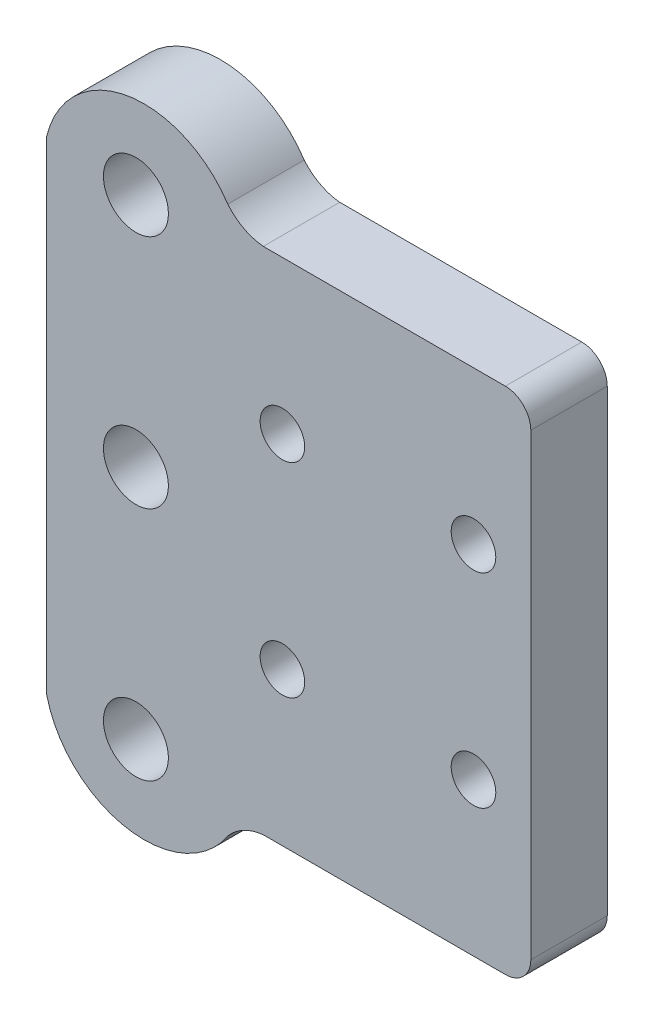
ISO-10303-21;
HEADER;
FILE_DESCRIPTION(('STEP AP214'),'2;1');
FILE_NAME('part.step','',(''),(''),'','','');
FILE_SCHEMA(('AUTOMOTIVE_DESIGN { 1 0 10303 214 1 1 1 1 }'));
ENDSEC;
DATA;
#1=APPLICATION_CONTEXT('core data for automotive mechanical design processes');
#2=APPLICATION_PROTOCOL_DEFINITION('international standard','automotive_design',2000,#1);
#3=PRODUCT_CONTEXT('',#1,'mechanical');
#4=PRODUCT('Part','Part','',(#3));
#5=PRODUCT_RELATED_PRODUCT_CATEGORY('part','',(#4));
#6=PRODUCT_DEFINITION_FORMATION('','',#4);
#7=PRODUCT_DEFINITION_CONTEXT('part definition',#1,'design');
#8=PRODUCT_DEFINITION('design','',#6,#7);
#9=PRODUCT_DEFINITION_SHAPE('','',#8);
#10=(LENGTH_UNIT() NAMED_UNIT(*) SI_UNIT(.MILLI.,.METRE.));
#11=(NAMED_UNIT(*) PLANE_ANGLE_UNIT() SI_UNIT($,.RADIAN.));
#12=(NAMED_UNIT(*) SI_UNIT($,.STERADIAN.) SOLID_ANGLE_UNIT());
#13=UNCERTAINTY_MEASURE_WITH_UNIT(LENGTH_MEASURE(1.E-05),#10,'distance_accuracy_value','');
#14=(GEOMETRIC_REPRESENTATION_CONTEXT(3) GLOBAL_UNCERTAINTY_ASSIGNED_CONTEXT((#13)) GLOBAL_UNIT_ASSIGNED_CONTEXT((#10,
#11,#12)) REPRESENTATION_CONTEXT('',''));
#15=CARTESIAN_POINT('',(0.,0.,0.));
#16=DIRECTION('',(0.,0.,1.));
#17=DIRECTION('',(1.,0.,0.));
#18=AXIS2_PLACEMENT_3D('',#15,#16,#17);
#19=CARTESIAN_POINT('',(-1.76996262716094E-11,275.368831893767,6.));
#20=DIRECTION('',(0.,1.,0.));
#21=DIRECTION('',(-1.,0.,0.));
#22=AXIS2_PLACEMENT_3D('',#19,#20,#21);
#23=PLANE('',#22);
#24=DIRECTION('',(1.,0.,0.));
#25=VECTOR('',#24,1.);
#26=CARTESIAN_POINT('',(-1.76996262716094E-11,275.368831893767,0.));
#27=LINE('',#26,#25);
#28=CARTESIAN_POINT('',(1000.97149925239,275.368831893832,0.));
#29=VERTEX_POINT('',#28);
#30=CARTESIAN_POINT('',(1019.97149925325,275.368831893833,0.));
#31=VERTEX_POINT('',#30);
#32=EDGE_CURVE('E148',#29,#31,#27,.T.);
#33=ORIENTED_EDGE('',*,*,#32,.T.);
#34=DIRECTION('',(0.,0.,-1.));
#35=VECTOR('',#34,1.);
#36=CARTESIAN_POINT('',(1019.97149925325,275.368831893833,6.));
#37=LINE('',#36,#35);
#38=CARTESIAN_POINT('',(1019.97149925325,275.368831893833,6.));
#39=VERTEX_POINT('',#38);
#40=EDGE_CURVE('E463',#39,#31,#37,.T.);
#41=ORIENTED_EDGE('',*,*,#40,.F.);
#42=DIRECTION('',(1.,0.,0.));
#43=VECTOR('',#42,1.);
#44=CARTESIAN_POINT('',(-1.76996262716094E-11,275.368831893767,6.));
#45=LINE('',#44,#43);
#46=CARTESIAN_POINT('',(1000.97149925239,275.368831893832,6.));
#47=VERTEX_POINT('',#46);
#48=EDGE_CURVE('E185',#47,#39,#45,.T.);
#49=ORIENTED_EDGE('',*,*,#48,.F.);
#50=DIRECTION('',(0.,0.,-1.));
#51=VECTOR('',#50,1.);
#52=CARTESIAN_POINT('',(1000.97149925239,275.368831893832,6.));
#53=LINE('',#52,#51);
#54=EDGE_CURVE('E98',#47,#29,#53,.T.);
#55=ORIENTED_EDGE('',*,*,#54,.T.);
#56=EDGE_LOOP('',(#33,#41,#49,#55));
#57=FACE_BOUND('',#56,.T.);
#58=ADVANCED_FACE('F35',(#57),#23,.F.);
#59=CARTESIAN_POINT('',(1019.97149925325,277.368831893833,6.));
#60=DIRECTION('',(0.,0.,-1.));
#61=DIRECTION('',(-1.,0.,0.));
#62=AXIS2_PLACEMENT_3D('',#59,#60,#61);
#63=CYLINDRICAL_SURFACE('',#62,2.);
#64=CARTESIAN_POINT('',(1019.97149925325,277.368831893833,0.));
#65=DIRECTION('',(0.,0.,1.));
#66=DIRECTION('',(1.,0.,0.));
#67=AXIS2_PLACEMENT_3D('',#64,#65,#66);
#68=CIRCLE('',#67,2.);
#69=CARTESIAN_POINT('',(1021.97149925325,277.368831893833,0.));
#70=VERTEX_POINT('',#69);
#71=EDGE_CURVE('E54',#31,#70,#68,.T.);
#72=ORIENTED_EDGE('',*,*,#71,.T.);
#73=DIRECTION('',(0.,0.,-1.));
#74=VECTOR('',#73,1.);
#75=CARTESIAN_POINT('',(1021.97149925325,277.368831893833,6.));
#76=LINE('',#75,#74);
#77=CARTESIAN_POINT('',(1021.97149925325,277.368831893833,6.));
#78=VERTEX_POINT('',#77);
#79=EDGE_CURVE('E126',#78,#70,#76,.T.);
#80=ORIENTED_EDGE('',*,*,#79,.F.);
#81=CARTESIAN_POINT('',(1019.97149925325,277.368831893833,6.));
#82=DIRECTION('',(0.,0.,1.));
#83=DIRECTION('',(1.,0.,0.));
#84=AXIS2_PLACEMENT_3D('',#81,#82,#83);
#85=CIRCLE('',#84,2.);
#86=EDGE_CURVE('E88',#39,#78,#85,.T.);
#87=ORIENTED_EDGE('',*,*,#86,.F.);
#88=ORIENTED_EDGE('',*,*,#40,.T.);
#89=EDGE_LOOP('',(#72,#80,#87,#88));
#90=FACE_BOUND('',#89,.T.);
#91=ADVANCED_FACE('F272',(#90),#63,.T.);
#92=CARTESIAN_POINT('',(1021.97149925325,0.,6.));
#93=DIRECTION('',(-1.,0.,0.));
#94=DIRECTION('',(0.,0.,1.));
#95=AXIS2_PLACEMENT_3D('',#92,#93,#94);
#96=PLANE('',#95);
#97=DIRECTION('',(0.,1.,0.));
#98=VECTOR('',#97,1.);
#99=CARTESIAN_POINT('',(1021.97149925325,0.,0.));
#100=LINE('',#99,#98);
#101=CARTESIAN_POINT('',(1021.97149925325,313.368831893827,0.));
#102=VERTEX_POINT('',#101);
#103=EDGE_CURVE('E120',#70,#102,#100,.T.);
#104=ORIENTED_EDGE('',*,*,#103,.T.);
#105=DIRECTION('',(0.,0.,-1.));
#106=VECTOR('',#105,1.);
#107=CARTESIAN_POINT('',(1021.97149925325,313.368831893827,6.));
#108=LINE('',#107,#106);
#109=CARTESIAN_POINT('',(1021.97149925325,313.368831893827,6.));
#110=VERTEX_POINT('',#109);
#111=EDGE_CURVE('E124',#110,#102,#108,.T.);
#112=ORIENTED_EDGE('',*,*,#111,.F.);
#113=DIRECTION('',(0.,1.,0.));
#114=VECTOR('',#113,1.);
#115=CARTESIAN_POINT('',(1021.97149925325,0.,6.));
#116=LINE('',#115,#114);
#117=EDGE_CURVE('E182',#78,#110,#116,.T.);
#118=ORIENTED_EDGE('',*,*,#117,.F.);
#119=ORIENTED_EDGE('',*,*,#79,.T.);
#120=EDGE_LOOP('',(#104,#112,#118,#119));
#121=FACE_BOUND('',#120,.T.);
#122=ADVANCED_FACE('F122',(#121),#96,.F.);
#123=CARTESIAN_POINT('',(1019.97149925325,313.368831893827,6.));
#124=DIRECTION('',(0.,0.,-1.));
#125=DIRECTION('',(-1.,0.,0.));
#126=AXIS2_PLACEMENT_3D('',#123,#124,#125);
#127=CYLINDRICAL_SURFACE('',#126,2.);
#128=CARTESIAN_POINT('',(1019.97149925325,313.368831893827,0.));
#129=DIRECTION('',(0.,0.,1.));
#130=DIRECTION('',(1.,0.,0.));
#131=AXIS2_PLACEMENT_3D('',#128,#129,#130);
#132=CIRCLE('',#131,2.);
#133=CARTESIAN_POINT('',(1019.97149925325,315.368831893827,0.));
#134=VERTEX_POINT('',#133);
#135=EDGE_CURVE('E128',#102,#134,#132,.T.);
#136=ORIENTED_EDGE('',*,*,#135,.T.);
#137=DIRECTION('',(0.,0.,-1.));
#138=VECTOR('',#137,1.);
#139=CARTESIAN_POINT('',(1019.97149925325,315.368831893827,6.));
#140=LINE('',#139,#138);
#141=CARTESIAN_POINT('',(1019.97149925325,315.368831893827,6.));
#142=VERTEX_POINT('',#141);
#143=EDGE_CURVE('E135',#142,#134,#140,.T.);
#144=ORIENTED_EDGE('',*,*,#143,.F.);
#145=CARTESIAN_POINT('',(1019.97149925325,313.368831893827,6.));
#146=DIRECTION('',(0.,0.,1.));
#147=DIRECTION('',(1.,0.,0.));
#148=AXIS2_PLACEMENT_3D('',#145,#146,#147);
#149=CIRCLE('',#148,2.);
#150=EDGE_CURVE('E134',#110,#142,#149,.T.);
#151=ORIENTED_EDGE('',*,*,#150,.F.);
#152=ORIENTED_EDGE('',*,*,#111,.T.);
#153=EDGE_LOOP('',(#136,#144,#151,#152));
#154=FACE_BOUND('',#153,.T.);
#155=ADVANCED_FACE('F131',(#154),#127,.T.);
#156=CARTESIAN_POINT('',(1.28995166779614E-11,315.368831893869,6.));
#157=DIRECTION('',(0.,-1.,0.));
#158=DIRECTION('',(1.,0.,0.));
#159=AXIS2_PLACEMENT_3D('',#156,#157,#158);
#160=PLANE('',#159);
#161=DIRECTION('',(-1.,0.,0.));
#162=VECTOR('',#161,1.);
#163=CARTESIAN_POINT('',(1.28995166779614E-11,315.368831893869,0.));
#164=LINE('',#163,#162);
#165=CARTESIAN_POINT('',(1000.97149925239,315.368831893828,0.));
#166=VERTEX_POINT('',#165);
#167=EDGE_CURVE('E141',#134,#166,#164,.T.);
#168=ORIENTED_EDGE('',*,*,#167,.T.);
#169=DIRECTION('',(0.,0.,-1.));
#170=VECTOR('',#169,1.);
#171=CARTESIAN_POINT('',(1000.97149925239,315.368831893828,6.));
#172=LINE('',#171,#170);
#173=CARTESIAN_POINT('',(1000.97149925239,315.368831893828,6.));
#174=VERTEX_POINT('',#173);
#175=EDGE_CURVE('E230',#174,#166,#172,.T.);
#176=ORIENTED_EDGE('',*,*,#175,.F.);
#177=DIRECTION('',(-1.,0.,0.));
#178=VECTOR('',#177,1.);
#179=CARTESIAN_POINT('',(1.28995166779614E-11,315.368831893869,6.));
#180=LINE('',#179,#178);
#181=EDGE_CURVE('E179',#142,#174,#180,.T.);
#182=ORIENTED_EDGE('',*,*,#181,.F.);
#183=ORIENTED_EDGE('',*,*,#143,.T.);
#184=EDGE_LOOP('',(#168,#176,#182,#183));
#185=FACE_BOUND('',#184,.T.);
#186=ADVANCED_FACE('F235',(#185),#160,.F.);
#187=CARTESIAN_POINT('',(1001.36737389531,319.488919964611,6.));
#188=DIRECTION('',(0.,0.,-1.));
#189=DIRECTION('',(-1.,0.,0.));
#190=AXIS2_PLACEMENT_3D('',#187,#188,#189);
#191=CYLINDRICAL_SURFACE('',#190,4.13906299105423);
#192=CARTESIAN_POINT('',(1001.36737389531,319.488919964611,0.));
#193=DIRECTION('',(0.,0.,1.));
#194=DIRECTION('',(1.,0.,0.));
#195=AXIS2_PLACEMENT_3D('',#192,#193,#194);
#196=CIRCLE('',#195,4.13906299105423);
#197=CARTESIAN_POINT('',(998.182822084059,316.844969850602,0.));
#198=VERTEX_POINT('',#197);
#199=EDGE_CURVE('E143',#198,#166,#196,.T.);
#200=ORIENTED_EDGE('',*,*,#199,.F.);
#201=DIRECTION('',(0.,0.,-1.));
#202=VECTOR('',#201,1.);
#203=CARTESIAN_POINT('',(998.182822084059,316.844969850602,6.));
#204=LINE('',#203,#202);
#205=CARTESIAN_POINT('',(998.182822084059,316.844969850602,6.));
#206=VERTEX_POINT('',#205);
#207=EDGE_CURVE('E227',#206,#198,#204,.T.);
#208=ORIENTED_EDGE('',*,*,#207,.F.);
#209=CARTESIAN_POINT('',(1001.36737389531,319.488919964611,6.));
#210=DIRECTION('',(0.,0.,1.));
#211=DIRECTION('',(1.,0.,0.));
#212=AXIS2_PLACEMENT_3D('',#209,#210,#211);
#213=CIRCLE('',#212,4.13906299105423);
#214=EDGE_CURVE('E176',#206,#174,#213,.T.);
#215=ORIENTED_EDGE('',*,*,#214,.T.);
#216=ORIENTED_EDGE('',*,*,#175,.T.);
#217=EDGE_LOOP('',(#200,#208,#215,#216));
#218=FACE_BOUND('',#217,.T.);
#219=ADVANCED_FACE('F226',(#218),#191,.F.);
#220=CARTESIAN_POINT('',(991.614131241241,312.525060403096,6.));
#221=DIRECTION('',(0.,0.,-1.));
#222=DIRECTION('',(-1.,0.,0.));
#223=AXIS2_PLACEMENT_3D('',#220,#221,#222);
#224=CYLINDRICAL_SURFACE('',#223,7.86189016860266);
#225=CARTESIAN_POINT('',(991.614131241241,312.525060403096,0.));
#226=DIRECTION('',(0.,0.,1.));
#227=DIRECTION('',(1.,0.,0.));
#228=AXIS2_PLACEMENT_3D('',#225,#226,#227);
#229=CIRCLE('',#228,7.86189016860266);
#230=CARTESIAN_POINT('',(983.971499252614,314.368831893707,0.));
#231=VERTEX_POINT('',#230);
#232=EDGE_CURVE('E221',#198,#231,#229,.T.);
#233=ORIENTED_EDGE('',*,*,#232,.T.);
#234=DIRECTION('',(0.,0.,-1.));
#235=VECTOR('',#234,1.);
#236=CARTESIAN_POINT('',(983.971499252614,314.368831893707,6.));
#237=LINE('',#236,#235);
#238=CARTESIAN_POINT('',(983.971499252614,314.368831893707,6.));
#239=VERTEX_POINT('',#238);
#240=EDGE_CURVE('E240',#239,#231,#237,.T.);
#241=ORIENTED_EDGE('',*,*,#240,.F.);
#242=CARTESIAN_POINT('',(991.614131241241,312.525060403096,6.));
#243=DIRECTION('',(0.,0.,1.));
#244=DIRECTION('',(1.,0.,0.));
#245=AXIS2_PLACEMENT_3D('',#242,#243,#244);
#246=CIRCLE('',#245,7.86189016860266);
#247=EDGE_CURVE('E174',#206,#239,#246,.T.);
#248=ORIENTED_EDGE('',*,*,#247,.F.);
#249=ORIENTED_EDGE('',*,*,#207,.T.);
#250=EDGE_LOOP('',(#233,#241,#248,#249));
#251=FACE_BOUND('',#250,.T.);
#252=ADVANCED_FACE('F259',(#251),#224,.T.);
#253=CARTESIAN_POINT('',(983.971499251172,-4.51536829197466E-09,6.));
#254=DIRECTION('',(1.,-4.58892182894624E-12,0.));
#255=DIRECTION('',(4.58892182894624E-12,1.,0.));
#256=AXIS2_PLACEMENT_3D('',#253,#254,#255);
#257=PLANE('',#256);
#258=DIRECTION('',(-4.58892182894624E-12,-1.,0.));
#259=VECTOR('',#258,1.);
#260=CARTESIAN_POINT('',(983.971499251172,-4.51536829197466E-09,0.));
#261=LINE('',#260,#259);
#262=CARTESIAN_POINT('',(983.971499252525,276.36883394131,0.));
#263=VERTEX_POINT('',#262);
#264=EDGE_CURVE('E215',#231,#263,#261,.T.);
#265=ORIENTED_EDGE('',*,*,#264,.T.);
#266=DIRECTION('',(0.,0.,-1.));
#267=VECTOR('',#266,1.);
#268=CARTESIAN_POINT('',(983.971499252525,276.36883394131,6.));
#269=LINE('',#268,#267);
#270=CARTESIAN_POINT('',(983.971499252525,276.36883394131,6.));
#271=VERTEX_POINT('',#270);
#272=EDGE_CURVE('E243',#271,#263,#269,.T.);
#273=ORIENTED_EDGE('',*,*,#272,.F.);
#274=DIRECTION('',(-4.58892182894624E-12,-1.,0.));
#275=VECTOR('',#274,1.);
#276=CARTESIAN_POINT('',(983.971499251172,-4.51536829197466E-09,6.));
#277=LINE('',#276,#275);
#278=EDGE_CURVE('E172',#239,#271,#277,.T.);
#279=ORIENTED_EDGE('',*,*,#278,.F.);
#280=ORIENTED_EDGE('',*,*,#240,.T.);
#281=EDGE_LOOP('',(#265,#273,#279,#280));
#282=FACE_BOUND('',#281,.T.);
#283=ADVANCED_FACE('F255',(#282),#257,.F.);
#284=CARTESIAN_POINT('',(991.614131430562,278.212602946912,6.));
#285=DIRECTION('',(0.,0.,-1.));
#286=DIRECTION('',(-1.,0.,0.));
#287=AXIS2_PLACEMENT_3D('',#284,#285,#286);
#288=CYLINDRICAL_SURFACE('',#287,7.86188976994601);
#289=CARTESIAN_POINT('',(991.614131430562,278.212602946912,0.));
#290=DIRECTION('',(0.,0.,1.));
#291=DIRECTION('',(1.,0.,0.));
#292=AXIS2_PLACEMENT_3D('',#289,#290,#291);
#293=CIRCLE('',#292,7.86188976994601);
#294=CARTESIAN_POINT('',(998.18282208406,273.892693937057,0.));
#295=VERTEX_POINT('',#294);
#296=EDGE_CURVE('E210',#263,#295,#293,.T.);
#297=ORIENTED_EDGE('',*,*,#296,.T.);
#298=DIRECTION('',(0.,0.,-1.));
#299=VECTOR('',#298,1.);
#300=CARTESIAN_POINT('',(998.18282208406,273.892693937057,6.));
#301=LINE('',#300,#299);
#302=CARTESIAN_POINT('',(998.18282208406,273.892693937057,6.));
#303=VERTEX_POINT('',#302);
#304=EDGE_CURVE('E245',#303,#295,#301,.T.);
#305=ORIENTED_EDGE('',*,*,#304,.F.);
#306=CARTESIAN_POINT('',(991.614131430562,278.212602946912,6.));
#307=DIRECTION('',(0.,0.,1.));
#308=DIRECTION('',(1.,0.,0.));
#309=AXIS2_PLACEMENT_3D('',#306,#307,#308);
#310=CIRCLE('',#309,7.86188976994601);
#311=EDGE_CURVE('E170',#271,#303,#310,.T.);
#312=ORIENTED_EDGE('',*,*,#311,.F.);
#313=ORIENTED_EDGE('',*,*,#272,.T.);
#314=EDGE_LOOP('',(#297,#305,#312,#313));
#315=FACE_BOUND('',#314,.T.);
#316=ADVANCED_FACE('F252',(#315),#288,.T.);
#317=CARTESIAN_POINT('',(990.971499252568,295.368831893827,6.));
#318=DIRECTION('',(0.,0.,-1.));
#319=DIRECTION('',(-1.,0.,0.));
#320=AXIS2_PLACEMENT_3D('',#317,#318,#319);
#321=CYLINDRICAL_SURFACE('',#320,2.55000000000005);
#322=CARTESIAN_POINT('',(990.971499252568,295.368831893827,6.));
#323=DIRECTION('',(0.,0.,1.));
#324=DIRECTION('',(1.,0.,0.));
#325=AXIS2_PLACEMENT_3D('',#322,#323,#324);
#326=CIRCLE('',#325,2.55000000000005);
#327=CARTESIAN_POINT('',(993.521499252568,295.368831893827,6.));
#328=VERTEX_POINT('',#327);
#329=EDGE_CURVE('E187',#328,#328,#326,.T.);
#330=ORIENTED_EDGE('',*,*,#329,.T.);
#331=EDGE_LOOP('',(#330));
#332=FACE_BOUND('',#331,.T.);
#333=CARTESIAN_POINT('',(990.971499252568,295.368831893827,0.));
#334=DIRECTION('',(0.,0.,1.));
#335=DIRECTION('',(1.,0.,0.));
#336=AXIS2_PLACEMENT_3D('',#333,#334,#335);
#337=CIRCLE('',#336,2.55000000000005);
#338=CARTESIAN_POINT('',(993.521499252568,295.368831893827,0.));
#339=VERTEX_POINT('',#338);
#340=EDGE_CURVE('E150',#339,#339,#337,.T.);
#341=ORIENTED_EDGE('',*,*,#340,.F.);
#342=EDGE_LOOP('',(#341));
#343=FACE_BOUND('',#342,.T.);
#344=ADVANCED_FACE('F279',(#332,#343),#321,.F.);
#345=CARTESIAN_POINT('',(1002.47149925257,287.368831893826,6.));
#346=DIRECTION('',(0.,0.,-1.));
#347=DIRECTION('',(-1.,0.,0.));
#348=AXIS2_PLACEMENT_3D('',#345,#346,#347);
#349=CYLINDRICAL_SURFACE('',#348,1.74999999999992);
#350=CARTESIAN_POINT('',(1002.47149925257,287.368831893826,6.));
#351=DIRECTION('',(0.,0.,1.));
#352=DIRECTION('',(1.,0.,0.));
#353=AXIS2_PLACEMENT_3D('',#350,#351,#352);
#354=CIRCLE('',#353,1.74999999999992);
#355=CARTESIAN_POINT('',(1004.22149925257,287.368831893826,6.));
#356=VERTEX_POINT('',#355);
#357=EDGE_CURVE('E190',#356,#356,#354,.T.);
#358=ORIENTED_EDGE('',*,*,#357,.T.);
#359=EDGE_LOOP('',(#358));
#360=FACE_BOUND('',#359,.T.);
#361=CARTESIAN_POINT('',(1002.47149925257,287.368831893826,0.));
#362=DIRECTION('',(0.,0.,1.));
#363=DIRECTION('',(1.,0.,0.));
#364=AXIS2_PLACEMENT_3D('',#361,#362,#363);
#365=CIRCLE('',#364,1.74999999999992);
#366=CARTESIAN_POINT('',(1004.22149925257,287.368831893826,0.));
#367=VERTEX_POINT('',#366);
#368=EDGE_CURVE('E153',#367,#367,#365,.T.);
#369=ORIENTED_EDGE('',*,*,#368,.F.);
#370=EDGE_LOOP('',(#369));
#371=FACE_BOUND('',#370,.T.);
#372=ADVANCED_FACE('F298',(#360,#371),#349,.F.);
#373=CARTESIAN_POINT('',(1017.47149925257,303.368831893827,6.));
#374=DIRECTION('',(0.,0.,-1.));
#375=DIRECTION('',(-1.,0.,0.));
#376=AXIS2_PLACEMENT_3D('',#373,#374,#375);
#377=CYLINDRICAL_SURFACE('',#376,1.74999999999992);
#378=CARTESIAN_POINT('',(1017.47149925257,303.368831893827,6.));
#379=DIRECTION('',(0.,0.,1.));
#380=DIRECTION('',(1.,0.,0.));
#381=AXIS2_PLACEMENT_3D('',#378,#379,#380);
#382=CIRCLE('',#381,1.74999999999992);
#383=CARTESIAN_POINT('',(1019.22149925257,303.368831893827,6.));
#384=VERTEX_POINT('',#383);
#385=EDGE_CURVE('E193',#384,#384,#382,.T.);
#386=ORIENTED_EDGE('',*,*,#385,.T.);
#387=EDGE_LOOP('',(#386));
#388=FACE_BOUND('',#387,.T.);
#389=CARTESIAN_POINT('',(1017.47149925257,303.368831893827,0.));
#390=DIRECTION('',(0.,0.,1.));
#391=DIRECTION('',(1.,0.,0.));
#392=AXIS2_PLACEMENT_3D('',#389,#390,#391);
#393=CIRCLE('',#392,1.74999999999992);
#394=CARTESIAN_POINT('',(1019.22149925257,303.368831893827,0.));
#395=VERTEX_POINT('',#394);
#396=EDGE_CURVE('E156',#395,#395,#393,.T.);
#397=ORIENTED_EDGE('',*,*,#396,.F.);
#398=EDGE_LOOP('',(#397));
#399=FACE_BOUND('',#398,.T.);
#400=ADVANCED_FACE('F303',(#388,#399),#377,.F.);
#401=CARTESIAN_POINT('',(990.971499252568,313.868831893828,6.));
#402=DIRECTION('',(0.,0.,-1.));
#403=DIRECTION('',(-1.,0.,0.));
#404=AXIS2_PLACEMENT_3D('',#401,#402,#403);
#405=CYLINDRICAL_SURFACE('',#404,2.55000000000005);
#406=CARTESIAN_POINT('',(990.971499252568,313.868831893828,6.));
#407=DIRECTION('',(0.,0.,1.));
#408=DIRECTION('',(1.,0.,0.));
#409=AXIS2_PLACEMENT_3D('',#406,#407,#408);
#410=CIRCLE('',#409,2.55000000000005);
#411=CARTESIAN_POINT('',(993.521499252568,313.868831893828,6.));
#412=VERTEX_POINT('',#411);
#413=EDGE_CURVE('E196',#412,#412,#410,.T.);
#414=ORIENTED_EDGE('',*,*,#413,.T.);
#415=EDGE_LOOP('',(#414));
#416=FACE_BOUND('',#415,.T.);
#417=CARTESIAN_POINT('',(990.971499252568,313.868831893828,0.));
#418=DIRECTION('',(0.,0.,1.));
#419=DIRECTION('',(1.,0.,0.));
#420=AXIS2_PLACEMENT_3D('',#417,#418,#419);
#421=CIRCLE('',#420,2.55000000000005);
#422=CARTESIAN_POINT('',(993.521499252568,313.868831893828,0.));
#423=VERTEX_POINT('',#422);
#424=EDGE_CURVE('E159',#423,#423,#421,.T.);
#425=ORIENTED_EDGE('',*,*,#424,.F.);
#426=EDGE_LOOP('',(#425));
#427=FACE_BOUND('',#426,.T.);
#428=ADVANCED_FACE('F313',(#416,#427),#405,.F.);
#429=CARTESIAN_POINT('',(990.971499252568,276.868831893827,6.));
#430=DIRECTION('',(0.,0.,-1.));
#431=DIRECTION('',(-1.,0.,0.));
#432=AXIS2_PLACEMENT_3D('',#429,#430,#431);
#433=CYLINDRICAL_SURFACE('',#432,2.55000000000005);
#434=CARTESIAN_POINT('',(990.971499252568,276.868831893827,6.));
#435=DIRECTION('',(0.,0.,1.));
#436=DIRECTION('',(1.,0.,0.));
#437=AXIS2_PLACEMENT_3D('',#434,#435,#436);
#438=CIRCLE('',#437,2.55000000000005);
#439=CARTESIAN_POINT('',(993.521499252568,276.868831893827,6.));
#440=VERTEX_POINT('',#439);
#441=EDGE_CURVE('E199',#440,#440,#438,.T.);
#442=ORIENTED_EDGE('',*,*,#441,.T.);
#443=EDGE_LOOP('',(#442));
#444=FACE_BOUND('',#443,.T.);
#445=CARTESIAN_POINT('',(990.971499252568,276.868831893827,0.));
#446=DIRECTION('',(0.,0.,1.));
#447=DIRECTION('',(1.,0.,0.));
#448=AXIS2_PLACEMENT_3D('',#445,#446,#447);
#449=CIRCLE('',#448,2.55000000000005);
#450=CARTESIAN_POINT('',(993.521499252568,276.868831893827,0.));
#451=VERTEX_POINT('',#450);
#452=EDGE_CURVE('E162',#451,#451,#449,.T.);
#453=ORIENTED_EDGE('',*,*,#452,.F.);
#454=EDGE_LOOP('',(#453));
#455=FACE_BOUND('',#454,.T.);
#456=ADVANCED_FACE('F320',(#444,#455),#433,.F.);
#457=CARTESIAN_POINT('',(1002.47149925257,303.368831893827,6.));
#458=DIRECTION('',(0.,0.,-1.));
#459=DIRECTION('',(-1.,0.,0.));
#460=AXIS2_PLACEMENT_3D('',#457,#458,#459);
#461=CYLINDRICAL_SURFACE('',#460,1.74999999999992);
#462=CARTESIAN_POINT('',(1002.47149925257,303.368831893827,6.));
#463=DIRECTION('',(0.,0.,1.));
#464=DIRECTION('',(1.,0.,0.));
#465=AXIS2_PLACEMENT_3D('',#462,#463,#464);
#466=CIRCLE('',#465,1.74999999999992);
#467=CARTESIAN_POINT('',(1004.22149925257,303.368831893827,6.));
#468=VERTEX_POINT('',#467);
#469=EDGE_CURVE('E201',#468,#468,#466,.T.);
#470=ORIENTED_EDGE('',*,*,#469,.T.);
#471=EDGE_LOOP('',(#470));
#472=FACE_BOUND('',#471,.T.);
#473=CARTESIAN_POINT('',(1002.47149925257,303.368831893827,0.));
#474=DIRECTION('',(0.,0.,1.));
#475=DIRECTION('',(1.,0.,0.));
#476=AXIS2_PLACEMENT_3D('',#473,#474,#475);
#477=CIRCLE('',#476,1.74999999999992);
#478=CARTESIAN_POINT('',(1004.22149925257,303.368831893827,0.));
#479=VERTEX_POINT('',#478);
#480=EDGE_CURVE('E45',#479,#479,#477,.T.);
#481=ORIENTED_EDGE('',*,*,#480,.F.);
#482=EDGE_LOOP('',(#481));
#483=FACE_BOUND('',#482,.T.);
#484=ADVANCED_FACE('F324',(#472,#483),#461,.F.);
#485=CARTESIAN_POINT('',(1017.47149925257,287.368831893826,6.));
#486=DIRECTION('',(0.,0.,-1.));
#487=DIRECTION('',(-1.,0.,0.));
#488=AXIS2_PLACEMENT_3D('',#485,#486,#487);
#489=CYLINDRICAL_SURFACE('',#488,1.74999999999992);
#490=CARTESIAN_POINT('',(1017.47149925257,287.368831893826,6.));
#491=DIRECTION('',(0.,0.,1.));
#492=DIRECTION('',(1.,0.,0.));
#493=AXIS2_PLACEMENT_3D('',#490,#491,#492);
#494=CIRCLE('',#493,1.74999999999992);
#495=CARTESIAN_POINT('',(1019.22149925257,287.368831893826,6.));
#496=VERTEX_POINT('',#495);
#497=EDGE_CURVE('E39',#496,#496,#494,.T.);
#498=ORIENTED_EDGE('',*,*,#497,.T.);
#499=EDGE_LOOP('',(#498));
#500=FACE_BOUND('',#499,.T.);
#501=CARTESIAN_POINT('',(1017.47149925257,287.368831893826,0.));
#502=DIRECTION('',(0.,0.,1.));
#503=DIRECTION('',(1.,0.,0.));
#504=AXIS2_PLACEMENT_3D('',#501,#502,#503);
#505=CIRCLE('',#504,1.74999999999992);
#506=CARTESIAN_POINT('',(1019.22149925257,287.368831893826,0.));
#507=VERTEX_POINT('',#506);
#508=EDGE_CURVE('E11',#507,#507,#505,.T.);
#509=ORIENTED_EDGE('',*,*,#508,.F.);
#510=EDGE_LOOP('',(#509));
#511=FACE_BOUND('',#510,.T.);
#512=ADVANCED_FACE('F268',(#500,#511),#489,.F.);
#513=CARTESIAN_POINT('',(1001.36737389531,271.248743823049,6.));
#514=DIRECTION('',(0.,0.,-1.));
#515=DIRECTION('',(-1.,0.,0.));
#516=AXIS2_PLACEMENT_3D('',#513,#514,#515);
#517=CYLINDRICAL_SURFACE('',#516,4.13906299105426);
#518=CARTESIAN_POINT('',(1001.36737389531,271.248743823049,0.));
#519=DIRECTION('',(0.,0.,1.));
#520=DIRECTION('',(1.,0.,0.));
#521=AXIS2_PLACEMENT_3D('',#518,#519,#520);
#522=CIRCLE('',#521,4.13906299105426);
#523=EDGE_CURVE('E206',#29,#295,#522,.T.);
#524=ORIENTED_EDGE('',*,*,#523,.F.);
#525=ORIENTED_EDGE('',*,*,#54,.F.);
#526=CARTESIAN_POINT('',(1001.36737389531,271.248743823049,6.));
#527=DIRECTION('',(0.,0.,1.));
#528=DIRECTION('',(1.,0.,0.));
#529=AXIS2_PLACEMENT_3D('',#526,#527,#528);
#530=CIRCLE('',#529,4.13906299105426);
#531=EDGE_CURVE('E167',#47,#303,#530,.T.);
#532=ORIENTED_EDGE('',*,*,#531,.T.);
#533=ORIENTED_EDGE('',*,*,#304,.T.);
#534=EDGE_LOOP('',(#524,#525,#532,#533));
#535=FACE_BOUND('',#534,.T.);
#536=ADVANCED_FACE('F248',(#535),#517,.F.);
#537=CARTESIAN_POINT('',(0.,0.,6.));
#538=DIRECTION('',(0.,0.,1.));
#539=DIRECTION('',(1.,0.,0.));
#540=AXIS2_PLACEMENT_3D('',#537,#538,#539);
#541=PLANE('',#540);
#542=ORIENTED_EDGE('',*,*,#497,.F.);
#543=EDGE_LOOP('',(#542));
#544=FACE_BOUND('',#543,.T.);
#545=ORIENTED_EDGE('',*,*,#469,.F.);
#546=EDGE_LOOP('',(#545));
#547=FACE_BOUND('',#546,.T.);
#548=ORIENTED_EDGE('',*,*,#441,.F.);
#549=EDGE_LOOP('',(#548));
#550=FACE_BOUND('',#549,.T.);
#551=ORIENTED_EDGE('',*,*,#413,.F.);
#552=EDGE_LOOP('',(#551));
#553=FACE_BOUND('',#552,.T.);
#554=ORIENTED_EDGE('',*,*,#385,.F.);
#555=EDGE_LOOP('',(#554));
#556=FACE_BOUND('',#555,.T.);
#557=ORIENTED_EDGE('',*,*,#357,.F.);
#558=EDGE_LOOP('',(#557));
#559=FACE_BOUND('',#558,.T.);
#560=ORIENTED_EDGE('',*,*,#329,.F.);
#561=EDGE_LOOP('',(#560));
#562=FACE_BOUND('',#561,.T.);
#563=ORIENTED_EDGE('',*,*,#48,.T.);
#564=ORIENTED_EDGE('',*,*,#86,.T.);
#565=ORIENTED_EDGE('',*,*,#117,.T.);
#566=ORIENTED_EDGE('',*,*,#150,.T.);
#567=ORIENTED_EDGE('',*,*,#181,.T.);
#568=ORIENTED_EDGE('',*,*,#214,.F.);
#569=ORIENTED_EDGE('',*,*,#247,.T.);
#570=ORIENTED_EDGE('',*,*,#278,.T.);
#571=ORIENTED_EDGE('',*,*,#311,.T.);
#572=ORIENTED_EDGE('',*,*,#531,.F.);
#573=EDGE_LOOP('',(#563,#564,#565,#566,#567,#568,#569,#570,#571,#572));
#574=FACE_BOUND('',#573,.T.);
#575=ADVANCED_FACE('F37',(#544,#547,#550,#553,#556,#559,#562,#574),#541,.T.);
#576=CARTESIAN_POINT('',(0.,0.,0.));
#577=DIRECTION('',(0.,0.,1.));
#578=DIRECTION('',(1.,0.,0.));
#579=AXIS2_PLACEMENT_3D('',#576,#577,#578);
#580=PLANE('',#579);
#581=ORIENTED_EDGE('',*,*,#508,.T.);
#582=EDGE_LOOP('',(#581));
#583=FACE_BOUND('',#582,.T.);
#584=ORIENTED_EDGE('',*,*,#480,.T.);
#585=EDGE_LOOP('',(#584));
#586=FACE_BOUND('',#585,.T.);
#587=ORIENTED_EDGE('',*,*,#452,.T.);
#588=EDGE_LOOP('',(#587));
#589=FACE_BOUND('',#588,.T.);
#590=ORIENTED_EDGE('',*,*,#424,.T.);
#591=EDGE_LOOP('',(#590));
#592=FACE_BOUND('',#591,.T.);
#593=ORIENTED_EDGE('',*,*,#396,.T.);
#594=EDGE_LOOP('',(#593));
#595=FACE_BOUND('',#594,.T.);
#596=ORIENTED_EDGE('',*,*,#368,.T.);
#597=EDGE_LOOP('',(#596));
#598=FACE_BOUND('',#597,.T.);
#599=ORIENTED_EDGE('',*,*,#340,.T.);
#600=EDGE_LOOP('',(#599));
#601=FACE_BOUND('',#600,.T.);
#602=ORIENTED_EDGE('',*,*,#32,.F.);
#603=ORIENTED_EDGE('',*,*,#523,.T.);
#604=ORIENTED_EDGE('',*,*,#296,.F.);
#605=ORIENTED_EDGE('',*,*,#264,.F.);
#606=ORIENTED_EDGE('',*,*,#232,.F.);
#607=ORIENTED_EDGE('',*,*,#199,.T.);
#608=ORIENTED_EDGE('',*,*,#167,.F.);
#609=ORIENTED_EDGE('',*,*,#135,.F.);
#610=ORIENTED_EDGE('',*,*,#103,.F.);
#611=ORIENTED_EDGE('',*,*,#71,.F.);
#612=EDGE_LOOP('',(#602,#603,#604,#605,#606,#607,#608,#609,#610,#611));
#613=FACE_BOUND('',#612,.T.);
#614=ADVANCED_FACE('F138',(#583,#586,#589,#592,#595,#598,#601,#613),#580,.F.);
#615=CLOSED_SHELL('',(#58,#91,#122,#155,#186,#219,#252,#283,#316,#344,#372,#400,#428,#456,#484,
#512,#536,#575,#614));
#616=MANIFOLD_SOLID_BREP('B2',#615);
#617=ADVANCED_BREP_SHAPE_REPRESENTATION('',(#18,#616),#14);
#618=SHAPE_DEFINITION_REPRESENTATION(#9,#617);
ENDSEC;
END-ISO-10303-21;
